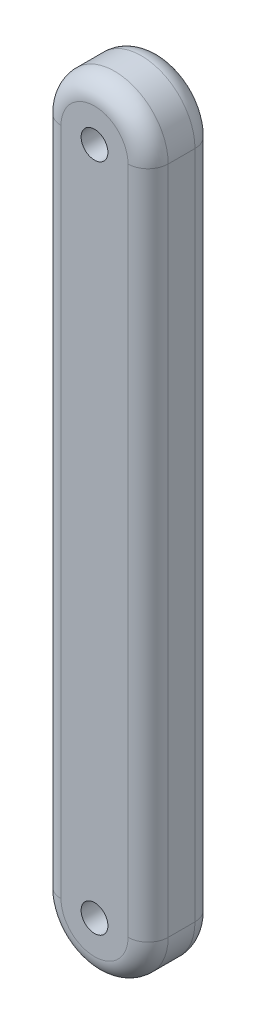
ISO-10303-21;
HEADER;
FILE_DESCRIPTION(('STEP AP214'),'2;1');
FILE_NAME('part.step','',(''),(''),'','','');
FILE_SCHEMA(('AUTOMOTIVE_DESIGN { 1 0 10303 214 1 1 1 1 }'));
ENDSEC;
DATA;
#1=APPLICATION_CONTEXT('core data for automotive mechanical design processes');
#2=APPLICATION_PROTOCOL_DEFINITION('international standard','automotive_design',2000,#1);
#3=PRODUCT_CONTEXT('',#1,'mechanical');
#4=PRODUCT('Part','Part','',(#3));
#5=PRODUCT_RELATED_PRODUCT_CATEGORY('part','',(#4));
#6=PRODUCT_DEFINITION_FORMATION('','',#4);
#7=PRODUCT_DEFINITION_CONTEXT('part definition',#1,'design');
#8=PRODUCT_DEFINITION('design','',#6,#7);
#9=PRODUCT_DEFINITION_SHAPE('','',#8);
#10=(LENGTH_UNIT() NAMED_UNIT(*) SI_UNIT(.MILLI.,.METRE.));
#11=(NAMED_UNIT(*) PLANE_ANGLE_UNIT() SI_UNIT($,.RADIAN.));
#12=(NAMED_UNIT(*) SI_UNIT($,.STERADIAN.) SOLID_ANGLE_UNIT());
#13=UNCERTAINTY_MEASURE_WITH_UNIT(LENGTH_MEASURE(1.E-05),#10,'distance_accuracy_value','');
#14=(GEOMETRIC_REPRESENTATION_CONTEXT(3) GLOBAL_UNCERTAINTY_ASSIGNED_CONTEXT((#13)) GLOBAL_UNIT_ASSIGNED_CONTEXT((#10,
#11,#12)) REPRESENTATION_CONTEXT('',''));
#15=CARTESIAN_POINT('',(0.,0.,0.));
#16=DIRECTION('',(0.,0.,1.));
#17=DIRECTION('',(1.,0.,0.));
#18=AXIS2_PLACEMENT_3D('',#15,#16,#17);
#19=CARTESIAN_POINT('',(0.,50.,10.));
#20=DIRECTION('',(0.,0.,1.));
#21=DIRECTION('',(1.,0.,0.));
#22=AXIS2_PLACEMENT_3D('',#19,#20,#21);
#23=PLANE('',#22);
#24=DIRECTION('',(0.,-1.,0.));
#25=VECTOR('',#24,1.);
#26=CARTESIAN_POINT('',(-4.99999999999997,-50.,10.));
#27=LINE('',#26,#25);
#28=CARTESIAN_POINT('',(-4.99999999999998,50.,10.));
#29=VERTEX_POINT('',#28);
#30=CARTESIAN_POINT('',(-4.99999999999997,-50.,10.));
#31=VERTEX_POINT('',#30);
#32=EDGE_CURVE('E136',#29,#31,#27,.T.);
#33=ORIENTED_EDGE('',*,*,#32,.T.);
#34=CARTESIAN_POINT('',(0.,-50.,10.));
#35=DIRECTION('',(0.,0.,1.));
#36=DIRECTION('',(1.,0.,0.));
#37=AXIS2_PLACEMENT_3D('',#34,#35,#36);
#38=CIRCLE('',#37,4.99999999999998);
#39=CARTESIAN_POINT('',(4.99999999999999,-50.,10.));
#40=VERTEX_POINT('',#39);
#41=EDGE_CURVE('E115',#31,#40,#38,.T.);
#42=ORIENTED_EDGE('',*,*,#41,.T.);
#43=DIRECTION('',(0.,1.,0.));
#44=VECTOR('',#43,1.);
#45=CARTESIAN_POINT('',(4.99999999999998,50.,10.));
#46=LINE('',#45,#44);
#47=CARTESIAN_POINT('',(4.99999999999998,50.,10.));
#48=VERTEX_POINT('',#47);
#49=EDGE_CURVE('E124',#40,#48,#46,.T.);
#50=ORIENTED_EDGE('',*,*,#49,.T.);
#51=CARTESIAN_POINT('',(0.,50.,10.));
#52=DIRECTION('',(0.,0.,1.));
#53=DIRECTION('',(1.,0.,0.));
#54=AXIS2_PLACEMENT_3D('',#51,#52,#53);
#55=CIRCLE('',#54,4.99999999999998);
#56=EDGE_CURVE('E131',#48,#29,#55,.T.);
#57=ORIENTED_EDGE('',*,*,#56,.T.);
#58=EDGE_LOOP('',(#33,#42,#50,#57));
#59=FACE_BOUND('',#58,.T.);
#60=CARTESIAN_POINT('',(0.,50.,10.));
#61=DIRECTION('',(0.,0.,1.));
#62=DIRECTION('',(1.,0.,0.));
#63=AXIS2_PLACEMENT_3D('',#60,#61,#62);
#64=CIRCLE('',#63,2.);
#65=CARTESIAN_POINT('',(2.,50.,10.));
#66=VERTEX_POINT('',#65);
#67=EDGE_CURVE('E226',#66,#66,#64,.T.);
#68=ORIENTED_EDGE('',*,*,#67,.F.);
#69=EDGE_LOOP('',(#68));
#70=FACE_BOUND('',#69,.T.);
#71=CARTESIAN_POINT('',(0.,-50.,10.));
#72=DIRECTION('',(0.,0.,1.));
#73=DIRECTION('',(1.,0.,0.));
#74=AXIS2_PLACEMENT_3D('',#71,#72,#73);
#75=CIRCLE('',#74,2.);
#76=CARTESIAN_POINT('',(2.,-50.,10.));
#77=VERTEX_POINT('',#76);
#78=EDGE_CURVE('E378',#77,#77,#75,.T.);
#79=ORIENTED_EDGE('',*,*,#78,.F.);
#80=EDGE_LOOP('',(#79));
#81=FACE_BOUND('',#80,.T.);
#82=ADVANCED_FACE('F41',(#59,#70,#81),#23,.T.);
#83=CARTESIAN_POINT('',(0.,50.,0.));
#84=DIRECTION('',(0.,0.,1.));
#85=DIRECTION('',(1.,0.,0.));
#86=AXIS2_PLACEMENT_3D('',#83,#84,#85);
#87=PLANE('',#86);
#88=DIRECTION('',(0.,1.,0.));
#89=VECTOR('',#88,1.);
#90=CARTESIAN_POINT('',(4.99999999999998,50.,0.));
#91=LINE('',#90,#89);
#92=CARTESIAN_POINT('',(4.99999999999998,50.,0.));
#93=VERTEX_POINT('',#92);
#94=CARTESIAN_POINT('',(4.99999999999999,-50.,0.));
#95=VERTEX_POINT('',#94);
#96=EDGE_CURVE('E162',#93,#95,#91,.F.);
#97=ORIENTED_EDGE('',*,*,#96,.T.);
#98=CARTESIAN_POINT('',(0.,-50.,0.));
#99=DIRECTION('',(0.,0.,1.));
#100=DIRECTION('',(1.,0.,0.));
#101=AXIS2_PLACEMENT_3D('',#98,#99,#100);
#102=CIRCLE('',#101,4.99999999999998);
#103=CARTESIAN_POINT('',(-4.99999999999997,-50.,0.));
#104=VERTEX_POINT('',#103);
#105=EDGE_CURVE('E170',#95,#104,#102,.F.);
#106=ORIENTED_EDGE('',*,*,#105,.T.);
#107=DIRECTION('',(0.,-1.,0.));
#108=VECTOR('',#107,1.);
#109=CARTESIAN_POINT('',(-4.99999999999997,50.,0.));
#110=LINE('',#109,#108);
#111=CARTESIAN_POINT('',(-4.99999999999998,50.,0.));
#112=VERTEX_POINT('',#111);
#113=EDGE_CURVE('E66',#104,#112,#110,.F.);
#114=ORIENTED_EDGE('',*,*,#113,.T.);
#115=CARTESIAN_POINT('',(0.,50.,0.));
#116=DIRECTION('',(0.,0.,1.));
#117=DIRECTION('',(1.,0.,0.));
#118=AXIS2_PLACEMENT_3D('',#115,#116,#117);
#119=CIRCLE('',#118,4.99999999999998);
#120=EDGE_CURVE('E165',#112,#93,#119,.F.);
#121=ORIENTED_EDGE('',*,*,#120,.T.);
#122=EDGE_LOOP('',(#97,#106,#114,#121));
#123=FACE_BOUND('',#122,.T.);
#124=CARTESIAN_POINT('',(0.,50.,0.));
#125=DIRECTION('',(0.,0.,1.));
#126=DIRECTION('',(1.,0.,0.));
#127=AXIS2_PLACEMENT_3D('',#124,#125,#126);
#128=CIRCLE('',#127,2.);
#129=CARTESIAN_POINT('',(2.,50.,0.));
#130=VERTEX_POINT('',#129);
#131=EDGE_CURVE('E385',#130,#130,#128,.T.);
#132=ORIENTED_EDGE('',*,*,#131,.T.);
#133=EDGE_LOOP('',(#132));
#134=FACE_BOUND('',#133,.T.);
#135=CARTESIAN_POINT('',(0.,-50.,0.));
#136=DIRECTION('',(0.,0.,1.));
#137=DIRECTION('',(1.,0.,0.));
#138=AXIS2_PLACEMENT_3D('',#135,#136,#137);
#139=CIRCLE('',#138,2.);
#140=CARTESIAN_POINT('',(2.,-50.,0.));
#141=VERTEX_POINT('',#140);
#142=EDGE_CURVE('E183',#141,#141,#139,.T.);
#143=ORIENTED_EDGE('',*,*,#142,.T.);
#144=EDGE_LOOP('',(#143));
#145=FACE_BOUND('',#144,.T.);
#146=ADVANCED_FACE('F203',(#123,#134,#145),#87,.F.);
#147=CARTESIAN_POINT('',(0.,50.,10.));
#148=DIRECTION('',(0.,0.,-1.));
#149=DIRECTION('',(-1.,0.,0.));
#150=AXIS2_PLACEMENT_3D('',#147,#148,#149);
#151=CYLINDRICAL_SURFACE('',#150,7.99999999999998);
#152=DIRECTION('',(0.,0.,-1.));
#153=VECTOR('',#152,1.);
#154=CARTESIAN_POINT('',(-7.99999999999997,50.,10.));
#155=LINE('',#154,#153);
#156=CARTESIAN_POINT('',(-7.99999999999997,50.,7.));
#157=VERTEX_POINT('',#156);
#158=CARTESIAN_POINT('',(-7.99999999999997,50.,3.));
#159=VERTEX_POINT('',#158);
#160=EDGE_CURVE('E132',#157,#159,#155,.T.);
#161=ORIENTED_EDGE('',*,*,#160,.F.);
#162=CARTESIAN_POINT('',(0.,50.,7.));
#163=DIRECTION('',(0.,0.,1.));
#164=DIRECTION('',(1.,0.,0.));
#165=AXIS2_PLACEMENT_3D('',#162,#163,#164);
#166=CIRCLE('',#165,7.99999999999998);
#167=CARTESIAN_POINT('',(7.99999999999998,50.,7.));
#168=VERTEX_POINT('',#167);
#169=EDGE_CURVE('E159',#157,#168,#166,.F.);
#170=ORIENTED_EDGE('',*,*,#169,.T.);
#171=DIRECTION('',(0.,0.,-1.));
#172=VECTOR('',#171,1.);
#173=CARTESIAN_POINT('',(7.99999999999998,50.,10.));
#174=LINE('',#173,#172);
#175=CARTESIAN_POINT('',(7.99999999999998,50.,3.));
#176=VERTEX_POINT('',#175);
#177=EDGE_CURVE('E221',#168,#176,#174,.T.);
#178=ORIENTED_EDGE('',*,*,#177,.T.);
#179=CARTESIAN_POINT('',(0.,50.,3.));
#180=DIRECTION('',(0.,0.,1.));
#181=DIRECTION('',(1.,0.,0.));
#182=AXIS2_PLACEMENT_3D('',#179,#180,#181);
#183=CIRCLE('',#182,7.99999999999998);
#184=EDGE_CURVE('E156',#176,#159,#183,.T.);
#185=ORIENTED_EDGE('',*,*,#184,.T.);
#186=EDGE_LOOP('',(#161,#170,#178,#185));
#187=FACE_BOUND('',#186,.T.);
#188=ADVANCED_FACE('F244',(#187),#151,.T.);
#189=CARTESIAN_POINT('',(-7.99999999999997,50.,10.));
#190=DIRECTION('',(1.,0.,0.));
#191=DIRECTION('',(0.,0.,-1.));
#192=AXIS2_PLACEMENT_3D('',#189,#190,#191);
#193=PLANE('',#192);
#194=DIRECTION('',(0.,0.,-1.));
#195=VECTOR('',#194,1.);
#196=CARTESIAN_POINT('',(-7.99999999999998,-50.,10.));
#197=LINE('',#196,#195);
#198=CARTESIAN_POINT('',(-7.99999999999998,-50.,7.));
#199=VERTEX_POINT('',#198);
#200=CARTESIAN_POINT('',(-7.99999999999998,-50.,3.));
#201=VERTEX_POINT('',#200);
#202=EDGE_CURVE('E218',#199,#201,#197,.T.);
#203=ORIENTED_EDGE('',*,*,#202,.F.);
#204=DIRECTION('',(0.,-1.,0.));
#205=VECTOR('',#204,1.);
#206=CARTESIAN_POINT('',(-7.99999999999997,50.,7.));
#207=LINE('',#206,#205);
#208=EDGE_CURVE('E153',#199,#157,#207,.F.);
#209=ORIENTED_EDGE('',*,*,#208,.T.);
#210=ORIENTED_EDGE('',*,*,#160,.T.);
#211=DIRECTION('',(0.,-1.,0.));
#212=VECTOR('',#211,1.);
#213=CARTESIAN_POINT('',(-7.99999999999997,50.,3.));
#214=LINE('',#213,#212);
#215=EDGE_CURVE('E150',#159,#201,#214,.T.);
#216=ORIENTED_EDGE('',*,*,#215,.T.);
#217=EDGE_LOOP('',(#203,#209,#210,#216));
#218=FACE_BOUND('',#217,.T.);
#219=ADVANCED_FACE('F242',(#218),#193,.F.);
#220=CARTESIAN_POINT('',(0.,-50.,10.));
#221=DIRECTION('',(0.,0.,-1.));
#222=DIRECTION('',(-1.,0.,0.));
#223=AXIS2_PLACEMENT_3D('',#220,#221,#222);
#224=CYLINDRICAL_SURFACE('',#223,7.99999999999998);
#225=DIRECTION('',(0.,0.,-1.));
#226=VECTOR('',#225,1.);
#227=CARTESIAN_POINT('',(7.99999999999999,-50.,10.));
#228=LINE('',#227,#226);
#229=CARTESIAN_POINT('',(7.99999999999999,-50.,7.));
#230=VERTEX_POINT('',#229);
#231=CARTESIAN_POINT('',(7.99999999999999,-50.,3.));
#232=VERTEX_POINT('',#231);
#233=EDGE_CURVE('E216',#230,#232,#228,.T.);
#234=ORIENTED_EDGE('',*,*,#233,.F.);
#235=CARTESIAN_POINT('',(0.,-50.,7.));
#236=DIRECTION('',(0.,0.,1.));
#237=DIRECTION('',(1.,0.,0.));
#238=AXIS2_PLACEMENT_3D('',#235,#236,#237);
#239=CIRCLE('',#238,7.99999999999998);
#240=EDGE_CURVE('E117',#230,#199,#239,.F.);
#241=ORIENTED_EDGE('',*,*,#240,.T.);
#242=ORIENTED_EDGE('',*,*,#202,.T.);
#243=CARTESIAN_POINT('',(0.,-50.,3.));
#244=DIRECTION('',(0.,0.,1.));
#245=DIRECTION('',(1.,0.,0.));
#246=AXIS2_PLACEMENT_3D('',#243,#244,#245);
#247=CIRCLE('',#246,7.99999999999998);
#248=EDGE_CURVE('E139',#201,#232,#247,.T.);
#249=ORIENTED_EDGE('',*,*,#248,.T.);
#250=EDGE_LOOP('',(#234,#241,#242,#249));
#251=FACE_BOUND('',#250,.T.);
#252=ADVANCED_FACE('F215',(#251),#224,.T.);
#253=CARTESIAN_POINT('',(7.99999999999998,50.,10.));
#254=DIRECTION('',(-1.,0.,0.));
#255=DIRECTION('',(0.,-1.,0.));
#256=AXIS2_PLACEMENT_3D('',#253,#254,#255);
#257=PLANE('',#256);
#258=ORIENTED_EDGE('',*,*,#177,.F.);
#259=DIRECTION('',(0.,1.,0.));
#260=VECTOR('',#259,1.);
#261=CARTESIAN_POINT('',(7.99999999999999,-50.,7.));
#262=LINE('',#261,#260);
#263=EDGE_CURVE('E11',#168,#230,#262,.F.);
#264=ORIENTED_EDGE('',*,*,#263,.T.);
#265=ORIENTED_EDGE('',*,*,#233,.T.);
#266=DIRECTION('',(0.,1.,0.));
#267=VECTOR('',#266,1.);
#268=CARTESIAN_POINT('',(7.99999999999998,50.,3.));
#269=LINE('',#268,#267);
#270=EDGE_CURVE('E51',#232,#176,#269,.T.);
#271=ORIENTED_EDGE('',*,*,#270,.T.);
#272=EDGE_LOOP('',(#258,#264,#265,#271));
#273=FACE_BOUND('',#272,.T.);
#274=ADVANCED_FACE('F219',(#273),#257,.F.);
#275=CARTESIAN_POINT('',(0.,50.,10.));
#276=DIRECTION('',(0.,0.,-1.));
#277=DIRECTION('',(-1.,0.,0.));
#278=AXIS2_PLACEMENT_3D('',#275,#276,#277);
#279=CYLINDRICAL_SURFACE('',#278,2.);
#280=ORIENTED_EDGE('',*,*,#67,.T.);
#281=EDGE_LOOP('',(#280));
#282=FACE_BOUND('',#281,.T.);
#283=ORIENTED_EDGE('',*,*,#131,.F.);
#284=EDGE_LOOP('',(#283));
#285=FACE_BOUND('',#284,.T.);
#286=ADVANCED_FACE('F259',(#282,#285),#279,.F.);
#287=CARTESIAN_POINT('',(0.,-50.,10.));
#288=DIRECTION('',(0.,0.,-1.));
#289=DIRECTION('',(-1.,0.,0.));
#290=AXIS2_PLACEMENT_3D('',#287,#288,#289);
#291=CYLINDRICAL_SURFACE('',#290,2.);
#292=ORIENTED_EDGE('',*,*,#78,.T.);
#293=EDGE_LOOP('',(#292));
#294=FACE_BOUND('',#293,.T.);
#295=ORIENTED_EDGE('',*,*,#142,.F.);
#296=EDGE_LOOP('',(#295));
#297=FACE_BOUND('',#296,.T.);
#298=ADVANCED_FACE('F280',(#294,#297),#291,.F.);
#299=CARTESIAN_POINT('',(0.,50.,7.));
#300=DIRECTION('',(0.,0.,1.));
#301=DIRECTION('',(1.,0.,0.));
#302=AXIS2_PLACEMENT_3D('',#299,#300,#301);
#303=TOROIDAL_SURFACE('',#302,4.99999999999998,3.);
#304=CARTESIAN_POINT('',(4.99999999999998,50.,7.));
#305=DIRECTION('',(0.,-1.,0.));
#306=DIRECTION('',(0.,0.,-1.));
#307=AXIS2_PLACEMENT_3D('',#304,#305,#306);
#308=CIRCLE('',#307,3.);
#309=EDGE_CURVE('E127',#168,#48,#308,.T.);
#310=ORIENTED_EDGE('',*,*,#309,.F.);
#311=ORIENTED_EDGE('',*,*,#169,.F.);
#312=CARTESIAN_POINT('',(-4.99999999999998,50.,7.));
#313=DIRECTION('',(0.,-1.,0.));
#314=DIRECTION('',(0.,0.,-1.));
#315=AXIS2_PLACEMENT_3D('',#312,#313,#314);
#316=CIRCLE('',#315,3.);
#317=EDGE_CURVE('E179',#29,#157,#316,.T.);
#318=ORIENTED_EDGE('',*,*,#317,.F.);
#319=ORIENTED_EDGE('',*,*,#56,.F.);
#320=EDGE_LOOP('',(#310,#311,#318,#319));
#321=FACE_BOUND('',#320,.T.);
#322=ADVANCED_FACE('F236',(#321),#303,.T.);
#323=CARTESIAN_POINT('',(-4.99999999999997,50.,7.));
#324=DIRECTION('',(0.,1.,0.));
#325=DIRECTION('',(0.,0.,1.));
#326=AXIS2_PLACEMENT_3D('',#323,#324,#325);
#327=CYLINDRICAL_SURFACE('',#326,3.);
#328=ORIENTED_EDGE('',*,*,#317,.T.);
#329=ORIENTED_EDGE('',*,*,#208,.F.);
#330=CARTESIAN_POINT('',(-4.99999999999997,-50.,7.));
#331=DIRECTION('',(0.,-1.,0.));
#332=DIRECTION('',(0.,0.,-1.));
#333=AXIS2_PLACEMENT_3D('',#330,#331,#332);
#334=CIRCLE('',#333,3.);
#335=EDGE_CURVE('E121',#31,#199,#334,.T.);
#336=ORIENTED_EDGE('',*,*,#335,.F.);
#337=ORIENTED_EDGE('',*,*,#32,.F.);
#338=EDGE_LOOP('',(#328,#329,#336,#337));
#339=FACE_BOUND('',#338,.T.);
#340=ADVANCED_FACE('F239',(#339),#327,.T.);
#341=CARTESIAN_POINT('',(4.99999999999998,50.,7.));
#342=DIRECTION('',(0.,-1.,0.));
#343=DIRECTION('',(1.,0.,0.));
#344=AXIS2_PLACEMENT_3D('',#341,#342,#343);
#345=CYLINDRICAL_SURFACE('',#344,3.);
#346=ORIENTED_EDGE('',*,*,#309,.T.);
#347=ORIENTED_EDGE('',*,*,#49,.F.);
#348=CARTESIAN_POINT('',(4.99999999999999,-50.,7.));
#349=DIRECTION('',(0.,-1.,0.));
#350=DIRECTION('',(0.,0.,-1.));
#351=AXIS2_PLACEMENT_3D('',#348,#349,#350);
#352=CIRCLE('',#351,3.);
#353=EDGE_CURVE('E111',#230,#40,#352,.T.);
#354=ORIENTED_EDGE('',*,*,#353,.F.);
#355=ORIENTED_EDGE('',*,*,#263,.F.);
#356=EDGE_LOOP('',(#346,#347,#354,#355));
#357=FACE_BOUND('',#356,.T.);
#358=ADVANCED_FACE('F125',(#357),#345,.T.);
#359=CARTESIAN_POINT('',(0.,-50.,7.));
#360=DIRECTION('',(0.,0.,1.));
#361=DIRECTION('',(1.,0.,0.));
#362=AXIS2_PLACEMENT_3D('',#359,#360,#361);
#363=TOROIDAL_SURFACE('',#362,4.99999999999998,3.);
#364=ORIENTED_EDGE('',*,*,#335,.T.);
#365=ORIENTED_EDGE('',*,*,#240,.F.);
#366=ORIENTED_EDGE('',*,*,#353,.T.);
#367=ORIENTED_EDGE('',*,*,#41,.F.);
#368=EDGE_LOOP('',(#364,#365,#366,#367));
#369=FACE_BOUND('',#368,.T.);
#370=ADVANCED_FACE('F113',(#369),#363,.T.);
#371=CARTESIAN_POINT('',(0.,50.,3.));
#372=DIRECTION('',(0.,0.,1.));
#373=DIRECTION('',(1.,0.,0.));
#374=AXIS2_PLACEMENT_3D('',#371,#372,#373);
#375=TOROIDAL_SURFACE('',#374,4.99999999999998,3.);
#376=CARTESIAN_POINT('',(4.99999999999998,50.,3.));
#377=DIRECTION('',(0.,-1.,0.));
#378=DIRECTION('',(0.,0.,-1.));
#379=AXIS2_PLACEMENT_3D('',#376,#377,#378);
#380=CIRCLE('',#379,3.);
#381=EDGE_CURVE('E188',#93,#176,#380,.T.);
#382=ORIENTED_EDGE('',*,*,#381,.F.);
#383=ORIENTED_EDGE('',*,*,#120,.F.);
#384=CARTESIAN_POINT('',(-4.99999999999998,50.,3.));
#385=DIRECTION('',(0.,-1.,0.));
#386=DIRECTION('',(0.,0.,-1.));
#387=AXIS2_PLACEMENT_3D('',#384,#385,#386);
#388=CIRCLE('',#387,3.);
#389=EDGE_CURVE('E45',#159,#112,#388,.T.);
#390=ORIENTED_EDGE('',*,*,#389,.F.);
#391=ORIENTED_EDGE('',*,*,#184,.F.);
#392=EDGE_LOOP('',(#382,#383,#390,#391));
#393=FACE_BOUND('',#392,.T.);
#394=ADVANCED_FACE('F43',(#393),#375,.T.);
#395=CARTESIAN_POINT('',(-4.99999999999997,50.,3.));
#396=DIRECTION('',(0.,-1.,0.));
#397=DIRECTION('',(0.,0.,-1.));
#398=AXIS2_PLACEMENT_3D('',#395,#396,#397);
#399=CYLINDRICAL_SURFACE('',#398,3.);
#400=ORIENTED_EDGE('',*,*,#389,.T.);
#401=ORIENTED_EDGE('',*,*,#113,.F.);
#402=CARTESIAN_POINT('',(-4.99999999999997,-50.,3.));
#403=DIRECTION('',(0.,-1.,0.));
#404=DIRECTION('',(0.,0.,-1.));
#405=AXIS2_PLACEMENT_3D('',#402,#403,#404);
#406=CIRCLE('',#405,3.);
#407=EDGE_CURVE('E59',#201,#104,#406,.T.);
#408=ORIENTED_EDGE('',*,*,#407,.F.);
#409=ORIENTED_EDGE('',*,*,#215,.F.);
#410=EDGE_LOOP('',(#400,#401,#408,#409));
#411=FACE_BOUND('',#410,.T.);
#412=ADVANCED_FACE('F200',(#411),#399,.T.);
#413=CARTESIAN_POINT('',(4.99999999999998,50.,3.));
#414=DIRECTION('',(0.,1.,0.));
#415=DIRECTION('',(-1.,0.,0.));
#416=AXIS2_PLACEMENT_3D('',#413,#414,#415);
#417=CYLINDRICAL_SURFACE('',#416,3.);
#418=ORIENTED_EDGE('',*,*,#381,.T.);
#419=ORIENTED_EDGE('',*,*,#270,.F.);
#420=CARTESIAN_POINT('',(4.99999999999999,-50.,3.));
#421=DIRECTION('',(0.,-1.,0.));
#422=DIRECTION('',(0.,0.,-1.));
#423=AXIS2_PLACEMENT_3D('',#420,#421,#422);
#424=CIRCLE('',#423,3.);
#425=EDGE_CURVE('E184',#95,#232,#424,.T.);
#426=ORIENTED_EDGE('',*,*,#425,.F.);
#427=ORIENTED_EDGE('',*,*,#96,.F.);
#428=EDGE_LOOP('',(#418,#419,#426,#427));
#429=FACE_BOUND('',#428,.T.);
#430=ADVANCED_FACE('F207',(#429),#417,.T.);
#431=CARTESIAN_POINT('',(0.,-50.,3.));
#432=DIRECTION('',(0.,0.,1.));
#433=DIRECTION('',(1.,0.,0.));
#434=AXIS2_PLACEMENT_3D('',#431,#432,#433);
#435=TOROIDAL_SURFACE('',#434,4.99999999999998,3.);
#436=ORIENTED_EDGE('',*,*,#407,.T.);
#437=ORIENTED_EDGE('',*,*,#105,.F.);
#438=ORIENTED_EDGE('',*,*,#425,.T.);
#439=ORIENTED_EDGE('',*,*,#248,.F.);
#440=EDGE_LOOP('',(#436,#437,#438,#439));
#441=FACE_BOUND('',#440,.T.);
#442=ADVANCED_FACE('F206',(#441),#435,.T.);
#443=CLOSED_SHELL('',(#82,#146,#188,#219,#252,#274,#286,#298,#322,#340,#358,#370,#394,#412,#430,#442));
#444=MANIFOLD_SOLID_BREP('B2',#443);
#445=ADVANCED_BREP_SHAPE_REPRESENTATION('',(#18,#444),#14);
#446=SHAPE_DEFINITION_REPRESENTATION(#9,#445);
ENDSEC;
END-ISO-10303-21;
